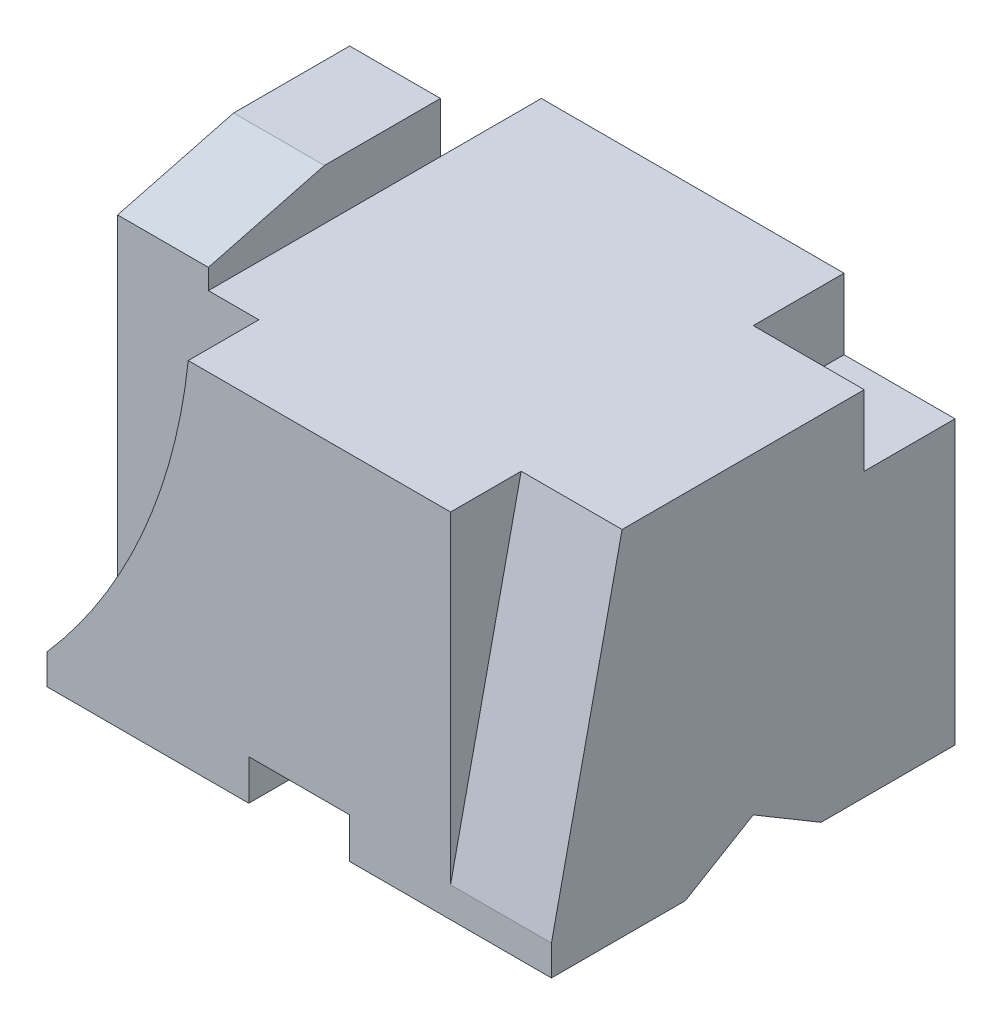
ISO-10303-21;
HEADER;
FILE_DESCRIPTION(('STEP AP214'),'2;1');
FILE_NAME('part.step','',(''),(''),'','','');
FILE_SCHEMA(('AUTOMOTIVE_DESIGN { 1 0 10303 214 1 1 1 1 }'));
ENDSEC;
DATA;
#1=APPLICATION_CONTEXT('core data for automotive mechanical design processes');
#2=APPLICATION_PROTOCOL_DEFINITION('international standard','automotive_design',2000,#1);
#3=PRODUCT_CONTEXT('',#1,'mechanical');
#4=PRODUCT('Part','Part','',(#3));
#5=PRODUCT_RELATED_PRODUCT_CATEGORY('part','',(#4));
#6=PRODUCT_DEFINITION_FORMATION('','',#4);
#7=PRODUCT_DEFINITION_CONTEXT('part definition',#1,'design');
#8=PRODUCT_DEFINITION('design','',#6,#7);
#9=PRODUCT_DEFINITION_SHAPE('','',#8);
#10=(LENGTH_UNIT() NAMED_UNIT(*) SI_UNIT(.MILLI.,.METRE.));
#11=(NAMED_UNIT(*) PLANE_ANGLE_UNIT() SI_UNIT($,.RADIAN.));
#12=(NAMED_UNIT(*) SI_UNIT($,.STERADIAN.) SOLID_ANGLE_UNIT());
#13=UNCERTAINTY_MEASURE_WITH_UNIT(LENGTH_MEASURE(1.E-05),#10,'distance_accuracy_value','');
#14=(GEOMETRIC_REPRESENTATION_CONTEXT(3) GLOBAL_UNCERTAINTY_ASSIGNED_CONTEXT((#13)) GLOBAL_UNIT_ASSIGNED_CONTEXT((#10,
#11,#12)) REPRESENTATION_CONTEXT('',''));
#15=CARTESIAN_POINT('',(0.,0.,0.));
#16=DIRECTION('',(0.,0.,1.));
#17=DIRECTION('',(1.,0.,0.));
#18=AXIS2_PLACEMENT_3D('',#15,#16,#17);
#19=CARTESIAN_POINT('',(0.,40.,-40.));
#20=DIRECTION('',(0.,0.,1.));
#21=DIRECTION('',(1.,0.,0.));
#22=AXIS2_PLACEMENT_3D('',#19,#20,#21);
#23=PLANE('',#22);
#24=DIRECTION('',(-1.,0.,0.));
#25=VECTOR('',#24,1.);
#26=CARTESIAN_POINT('',(0.,28.,-40.));
#27=LINE('',#26,#25);
#28=CARTESIAN_POINT('',(50.,28.,-40.));
#29=VERTEX_POINT('',#28);
#30=CARTESIAN_POINT('',(39.,28.,-40.));
#31=VERTEX_POINT('',#30);
#32=EDGE_CURVE('E217',#29,#31,#27,.T.);
#33=ORIENTED_EDGE('',*,*,#32,.F.);
#34=DIRECTION('',(0.,-1.,0.));
#35=VECTOR('',#34,1.);
#36=CARTESIAN_POINT('',(50.,40.,-40.));
#37=LINE('',#36,#35);
#38=CARTESIAN_POINT('',(50.,0.,-40.));
#39=VERTEX_POINT('',#38);
#40=EDGE_CURVE('E396',#29,#39,#37,.T.);
#41=ORIENTED_EDGE('',*,*,#40,.T.);
#42=DIRECTION('',(-1.,0.,0.));
#43=VECTOR('',#42,1.);
#44=CARTESIAN_POINT('',(0.,0.,-40.));
#45=LINE('',#44,#43);
#46=CARTESIAN_POINT('',(30.,0.,-40.));
#47=VERTEX_POINT('',#46);
#48=EDGE_CURVE('E386',#39,#47,#45,.T.);
#49=ORIENTED_EDGE('',*,*,#48,.T.);
#50=DIRECTION('',(0.,-1.,0.));
#51=VECTOR('',#50,1.);
#52=CARTESIAN_POINT('',(30.,0.,-40.));
#53=LINE('',#52,#51);
#54=CARTESIAN_POINT('',(30.,4.,-40.));
#55=VERTEX_POINT('',#54);
#56=EDGE_CURVE('E345',#55,#47,#53,.T.);
#57=ORIENTED_EDGE('',*,*,#56,.F.);
#58=DIRECTION('',(1.,0.,0.));
#59=VECTOR('',#58,1.);
#60=CARTESIAN_POINT('',(0.,4.,-40.));
#61=LINE('',#60,#59);
#62=CARTESIAN_POINT('',(20.,4.,-40.));
#63=VERTEX_POINT('',#62);
#64=EDGE_CURVE('E347',#63,#55,#61,.T.);
#65=ORIENTED_EDGE('',*,*,#64,.F.);
#66=DIRECTION('',(0.,-1.,0.));
#67=VECTOR('',#66,1.);
#68=CARTESIAN_POINT('',(20.,0.,-40.));
#69=LINE('',#68,#67);
#70=CARTESIAN_POINT('',(20.,0.,-40.));
#71=VERTEX_POINT('',#70);
#72=EDGE_CURVE('E349',#63,#71,#69,.T.);
#73=ORIENTED_EDGE('',*,*,#72,.T.);
#74=CARTESIAN_POINT('',(0.,0.,-40.));
#75=VERTEX_POINT('',#74);
#76=EDGE_CURVE('E465',#71,#75,#45,.T.);
#77=ORIENTED_EDGE('',*,*,#76,.T.);
#78=DIRECTION('',(0.,-1.,0.));
#79=VECTOR('',#78,1.);
#80=CARTESIAN_POINT('',(0.,40.,-40.));
#81=LINE('',#80,#79);
#82=CARTESIAN_POINT('',(0.,22.,-40.));
#83=VERTEX_POINT('',#82);
#84=EDGE_CURVE('E385',#83,#75,#81,.T.);
#85=ORIENTED_EDGE('',*,*,#84,.F.);
#86=DIRECTION('',(1.,0.,0.));
#87=VECTOR('',#86,1.);
#88=CARTESIAN_POINT('',(-156.873028952982,22.,-39.9999999999999));
#89=LINE('',#88,#87);
#90=CARTESIAN_POINT('',(8.99999999999997,22.,-40.));
#91=VERTEX_POINT('',#90);
#92=EDGE_CURVE('E251',#83,#91,#89,.T.);
#93=ORIENTED_EDGE('',*,*,#92,.T.);
#94=DIRECTION('',(0.,1.,0.));
#95=VECTOR('',#94,1.);
#96=CARTESIAN_POINT('',(8.99999999999999,40.,-40.));
#97=LINE('',#96,#95);
#98=CARTESIAN_POINT('',(9.00000000000001,35.,-40.));
#99=VERTEX_POINT('',#98);
#100=EDGE_CURVE('E388',#91,#99,#97,.T.);
#101=ORIENTED_EDGE('',*,*,#100,.T.);
#102=DIRECTION('',(1.,0.,0.));
#103=VECTOR('',#102,1.);
#104=CARTESIAN_POINT('',(0.,35.,-40.));
#105=LINE('',#104,#103);
#106=CARTESIAN_POINT('',(39.,35.,-40.));
#107=VERTEX_POINT('',#106);
#108=EDGE_CURVE('E304',#99,#107,#105,.T.);
#109=ORIENTED_EDGE('',*,*,#108,.T.);
#110=DIRECTION('',(0.,1.,0.));
#111=VECTOR('',#110,1.);
#112=CARTESIAN_POINT('',(39.,40.,-40.));
#113=LINE('',#112,#111);
#114=EDGE_CURVE('E235',#31,#107,#113,.T.);
#115=ORIENTED_EDGE('',*,*,#114,.F.);
#116=EDGE_LOOP('',(#33,#41,#49,#57,#65,#73,#77,#85,#93,#101,#109,#115));
#117=FACE_BOUND('',#116,.T.);
#118=ADVANCED_FACE('F35',(#117),#23,.F.);
#119=CARTESIAN_POINT('',(0.,35.,-40.));
#120=DIRECTION('',(0.,-1.,0.));
#121=DIRECTION('',(0.,0.,-1.));
#122=AXIS2_PLACEMENT_3D('',#119,#120,#121);
#123=PLANE('',#122);
#124=DIRECTION('',(0.,0.,1.));
#125=VECTOR('',#124,1.);
#126=CARTESIAN_POINT('',(39.,35.,-40.000012));
#127=LINE('',#126,#125);
#128=CARTESIAN_POINT('',(39.,35.,-31.));
#129=VERTEX_POINT('',#128);
#130=EDGE_CURVE('E220',#107,#129,#127,.T.);
#131=ORIENTED_EDGE('',*,*,#130,.F.);
#132=ORIENTED_EDGE('',*,*,#108,.F.);
#133=DIRECTION('',(0.,0.,1.));
#134=VECTOR('',#133,1.);
#135=CARTESIAN_POINT('',(9.00000000000001,35.,-40.));
#136=LINE('',#135,#134);
#137=CARTESIAN_POINT('',(9.00000000000001,35.,-30.));
#138=VERTEX_POINT('',#137);
#139=EDGE_CURVE('E314',#99,#138,#136,.T.);
#140=ORIENTED_EDGE('',*,*,#139,.T.);
#141=CARTESIAN_POINT('',(9.00000000000001,35.,-7.));
#142=VERTEX_POINT('',#141);
#143=EDGE_CURVE('E307',#138,#142,#136,.T.);
#144=ORIENTED_EDGE('',*,*,#143,.T.);
#145=DIRECTION('',(-1.,0.,0.));
#146=VECTOR('',#145,1.);
#147=CARTESIAN_POINT('',(0.,35.,-7.));
#148=LINE('',#147,#146);
#149=CARTESIAN_POINT('',(14.,35.,-7.));
#150=VERTEX_POINT('',#149);
#151=EDGE_CURVE('E290',#150,#142,#148,.T.);
#152=ORIENTED_EDGE('',*,*,#151,.F.);
#153=DIRECTION('',(0.,0.,1.));
#154=VECTOR('',#153,1.);
#155=CARTESIAN_POINT('',(14.,35.,-7.));
#156=LINE('',#155,#154);
#157=CARTESIAN_POINT('',(14.,35.,0.));
#158=VERTEX_POINT('',#157);
#159=EDGE_CURVE('E298',#150,#158,#156,.T.);
#160=ORIENTED_EDGE('',*,*,#159,.T.);
#161=DIRECTION('',(-1.,0.,0.));
#162=VECTOR('',#161,1.);
#163=CARTESIAN_POINT('',(0.,35.,0.));
#164=LINE('',#163,#162);
#165=CARTESIAN_POINT('',(40.,35.,0.));
#166=VERTEX_POINT('',#165);
#167=EDGE_CURVE('E311',#166,#158,#164,.T.);
#168=ORIENTED_EDGE('',*,*,#167,.F.);
#169=DIRECTION('',(0.,0.,1.));
#170=VECTOR('',#169,1.);
#171=CARTESIAN_POINT('',(40.,35.,0.));
#172=LINE('',#171,#170);
#173=CARTESIAN_POINT('',(40.,35.,-7.00000000000001));
#174=VERTEX_POINT('',#173);
#175=EDGE_CURVE('E274',#174,#166,#172,.T.);
#176=ORIENTED_EDGE('',*,*,#175,.F.);
#177=DIRECTION('',(-1.,0.,0.));
#178=VECTOR('',#177,1.);
#179=CARTESIAN_POINT('',(50.000012,35.,-7.00000000000001));
#180=LINE('',#179,#178);
#181=CARTESIAN_POINT('',(50.,35.,-7.00000000000001));
#182=VERTEX_POINT('',#181);
#183=EDGE_CURVE('E277',#182,#174,#180,.T.);
#184=ORIENTED_EDGE('',*,*,#183,.F.);
#185=DIRECTION('',(0.,0.,1.));
#186=VECTOR('',#185,1.);
#187=CARTESIAN_POINT('',(50.,35.,-40.));
#188=LINE('',#187,#186);
#189=CARTESIAN_POINT('',(50.,35.,-31.));
#190=VERTEX_POINT('',#189);
#191=EDGE_CURVE('E312',#190,#182,#188,.T.);
#192=ORIENTED_EDGE('',*,*,#191,.F.);
#193=DIRECTION('',(1.,0.,0.));
#194=VECTOR('',#193,1.);
#195=CARTESIAN_POINT('',(0.,35.,-31.));
#196=LINE('',#195,#194);
#197=EDGE_CURVE('E50',#129,#190,#196,.T.);
#198=ORIENTED_EDGE('',*,*,#197,.F.);
#199=EDGE_LOOP('',(#131,#132,#140,#144,#152,#160,#168,#176,#184,#192,#198));
#200=FACE_BOUND('',#199,.T.);
#201=ADVANCED_FACE('F474',(#200),#123,.F.);
#202=CARTESIAN_POINT('',(50.,40.,0.));
#203=DIRECTION('',(-1.,0.,0.));
#204=DIRECTION('',(0.,0.,1.));
#205=AXIS2_PLACEMENT_3D('',#202,#203,#204);
#206=PLANE('',#205);
#207=DIRECTION('',(0.,0.,-1.));
#208=VECTOR('',#207,1.);
#209=CARTESIAN_POINT('',(50.,28.,0.));
#210=LINE('',#209,#208);
#211=CARTESIAN_POINT('',(50.,28.,-31.));
#212=VERTEX_POINT('',#211);
#213=EDGE_CURVE('E11',#212,#29,#210,.T.);
#214=ORIENTED_EDGE('',*,*,#213,.F.);
#215=DIRECTION('',(0.,-1.,0.));
#216=VECTOR('',#215,1.);
#217=CARTESIAN_POINT('',(50.,0.,-31.));
#218=LINE('',#217,#216);
#219=EDGE_CURVE('E227',#190,#212,#218,.T.);
#220=ORIENTED_EDGE('',*,*,#219,.F.);
#221=ORIENTED_EDGE('',*,*,#191,.T.);
#222=DIRECTION('',(0.,0.976900017396262,-0.213696878805433));
#223=VECTOR('',#222,1.);
#224=CARTESIAN_POINT('',(50.,38.3103448275862,-7.72413793103449));
#225=LINE('',#224,#223);
#226=CARTESIAN_POINT('',(50.,3.00000000000008,0.));
#227=VERTEX_POINT('',#226);
#228=EDGE_CURVE('E279',#227,#182,#225,.T.);
#229=ORIENTED_EDGE('',*,*,#228,.F.);
#230=DIRECTION('',(0.,-1.,0.));
#231=VECTOR('',#230,1.);
#232=CARTESIAN_POINT('',(50.,40.,0.));
#233=LINE('',#232,#231);
#234=CARTESIAN_POINT('',(50.,0.,0.));
#235=VERTEX_POINT('',#234);
#236=EDGE_CURVE('E392',#227,#235,#233,.T.);
#237=ORIENTED_EDGE('',*,*,#236,.T.);
#238=DIRECTION('',(0.,0.,-1.));
#239=VECTOR('',#238,1.);
#240=CARTESIAN_POINT('',(50.,0.,0.));
#241=LINE('',#240,#239);
#242=CARTESIAN_POINT('',(50.,0.,-13.2783519094649));
#243=VERTEX_POINT('',#242);
#244=EDGE_CURVE('E441',#235,#243,#241,.T.);
#245=ORIENTED_EDGE('',*,*,#244,.T.);
#246=DIRECTION('',(0.,0.511391249008345,-0.859348003103332));
#247=VECTOR('',#246,1.);
#248=CARTESIAN_POINT('',(50.,-5.83534501104606,-3.47256799668696));
#249=LINE('',#248,#247);
#250=CARTESIAN_POINT('',(50.,4.,-20.));
#251=VERTEX_POINT('',#250);
#252=EDGE_CURVE('E318',#243,#251,#249,.T.);
#253=ORIENTED_EDGE('',*,*,#252,.T.);
#254=DIRECTION('',(0.,0.511391249008345,0.859348003103333));
#255=VECTOR('',#254,1.);
#256=CARTESIAN_POINT('',(50.,11.7431769345475,-6.98827238580567));
#257=LINE('',#256,#255);
#258=CARTESIAN_POINT('',(50.,0.,-26.7216480905352));
#259=VERTEX_POINT('',#258);
#260=EDGE_CURVE('E321',#259,#251,#257,.T.);
#261=ORIENTED_EDGE('',*,*,#260,.F.);
#262=EDGE_CURVE('E432',#259,#39,#241,.T.);
#263=ORIENTED_EDGE('',*,*,#262,.T.);
#264=ORIENTED_EDGE('',*,*,#40,.F.);
#265=EDGE_LOOP('',(#214,#220,#221,#229,#237,#245,#253,#261,#263,#264));
#266=FACE_BOUND('',#265,.T.);
#267=ADVANCED_FACE('F437',(#266),#206,.F.);
#268=CARTESIAN_POINT('',(0.,40.,0.));
#269=DIRECTION('',(1.,0.,0.));
#270=DIRECTION('',(0.,0.,-1.));
#271=AXIS2_PLACEMENT_3D('',#268,#269,#270);
#272=PLANE('',#271);
#273=DIRECTION('',(0.,-0.252421897147002,0.967617272396844));
#274=VECTOR('',#273,1.);
#275=CARTESIAN_POINT('',(0.,35.4814159292035,-1.1787610619469));
#276=LINE('',#275,#274);
#277=CARTESIAN_POINT('',(0.,40.,-18.5));
#278=VERTEX_POINT('',#277);
#279=CARTESIAN_POINT('',(0.,37.,-7.));
#280=VERTEX_POINT('',#279);
#281=EDGE_CURVE('E58',#278,#280,#276,.T.);
#282=ORIENTED_EDGE('',*,*,#281,.F.);
#283=DIRECTION('',(0.,0.,1.));
#284=VECTOR('',#283,1.);
#285=CARTESIAN_POINT('',(0.,40.,0.));
#286=LINE('',#285,#284);
#287=CARTESIAN_POINT('',(0.,40.,-30.));
#288=VERTEX_POINT('',#287);
#289=EDGE_CURVE('E382',#288,#278,#286,.T.);
#290=ORIENTED_EDGE('',*,*,#289,.F.);
#291=DIRECTION('',(0.,-1.,0.));
#292=VECTOR('',#291,1.);
#293=CARTESIAN_POINT('',(0.,22.,-30.));
#294=LINE('',#293,#292);
#295=CARTESIAN_POINT('',(0.,22.,-30.));
#296=VERTEX_POINT('',#295);
#297=EDGE_CURVE('E245',#288,#296,#294,.T.);
#298=ORIENTED_EDGE('',*,*,#297,.T.);
#299=DIRECTION('',(0.,0.,-1.));
#300=VECTOR('',#299,1.);
#301=CARTESIAN_POINT('',(0.,22.,-40.));
#302=LINE('',#301,#300);
#303=EDGE_CURVE('E256',#296,#83,#302,.T.);
#304=ORIENTED_EDGE('',*,*,#303,.T.);
#305=ORIENTED_EDGE('',*,*,#84,.T.);
#306=DIRECTION('',(0.,0.,1.));
#307=VECTOR('',#306,1.);
#308=CARTESIAN_POINT('',(0.,0.,0.));
#309=LINE('',#308,#307);
#310=CARTESIAN_POINT('',(0.,0.,-26.7216480905352));
#311=VERTEX_POINT('',#310);
#312=EDGE_CURVE('E380',#75,#311,#309,.T.);
#313=ORIENTED_EDGE('',*,*,#312,.T.);
#314=DIRECTION('',(0.,-0.511391249008345,-0.859348003103332));
#315=VECTOR('',#314,1.);
#316=CARTESIAN_POINT('',(0.,22.2040173170401,10.5902495597879));
#317=LINE('',#316,#315);
#318=CARTESIAN_POINT('',(0.,4.,-20.));
#319=VERTEX_POINT('',#318);
#320=EDGE_CURVE('E343',#319,#311,#317,.T.);
#321=ORIENTED_EDGE('',*,*,#320,.F.);
#322=DIRECTION('',(0.,-0.511391249008345,0.859348003103332));
#323=VECTOR('',#322,1.);
#324=CARTESIAN_POINT('',(0.,4.62549537144653,-21.0510899422806));
#325=LINE('',#324,#323);
#326=CARTESIAN_POINT('',(0.,0.,-13.2783519094648));
#327=VERTEX_POINT('',#326);
#328=EDGE_CURVE('E337',#319,#327,#325,.T.);
#329=ORIENTED_EDGE('',*,*,#328,.T.);
#330=CARTESIAN_POINT('',(0.,0.,0.));
#331=VERTEX_POINT('',#330);
#332=EDGE_CURVE('E377',#327,#331,#309,.T.);
#333=ORIENTED_EDGE('',*,*,#332,.T.);
#334=DIRECTION('',(0.,-1.,0.));
#335=VECTOR('',#334,1.);
#336=CARTESIAN_POINT('',(0.,40.,0.));
#337=LINE('',#336,#335);
#338=CARTESIAN_POINT('',(0.,3.,0.));
#339=VERTEX_POINT('',#338);
#340=EDGE_CURVE('E395',#339,#331,#337,.T.);
#341=ORIENTED_EDGE('',*,*,#340,.F.);
#342=DIRECTION('',(0.,0.,1.));
#343=VECTOR('',#342,1.);
#344=CARTESIAN_POINT('',(0.,3.,-7.));
#345=LINE('',#344,#343);
#346=CARTESIAN_POINT('',(0.,3.,-7.));
#347=VERTEX_POINT('',#346);
#348=EDGE_CURVE('E301',#347,#339,#345,.T.);
#349=ORIENTED_EDGE('',*,*,#348,.F.);
#350=DIRECTION('',(0.,-1.,0.));
#351=VECTOR('',#350,1.);
#352=CARTESIAN_POINT('',(0.,0.,-7.));
#353=LINE('',#352,#351);
#354=EDGE_CURVE('E296',#280,#347,#353,.T.);
#355=ORIENTED_EDGE('',*,*,#354,.F.);
#356=EDGE_LOOP('',(#282,#290,#298,#304,#305,#313,#321,#329,#333,#341,#349,#355));
#357=FACE_BOUND('',#356,.T.);
#358=ADVANCED_FACE('F37',(#357),#272,.F.);
#359=CARTESIAN_POINT('',(0.,40.,0.));
#360=DIRECTION('',(0.,-1.,0.));
#361=DIRECTION('',(0.,0.,-1.));
#362=AXIS2_PLACEMENT_3D('',#359,#360,#361);
#363=PLANE('',#362);
#364=DIRECTION('',(-1.,0.,0.));
#365=VECTOR('',#364,1.);
#366=CARTESIAN_POINT('',(8.99999999999999,40.,-18.5));
#367=LINE('',#366,#365);
#368=CARTESIAN_POINT('',(8.99999999999999,40.,-18.5));
#369=VERTEX_POINT('',#368);
#370=EDGE_CURVE('E240',#369,#278,#367,.T.);
#371=ORIENTED_EDGE('',*,*,#370,.F.);
#372=DIRECTION('',(0.,0.,1.));
#373=VECTOR('',#372,1.);
#374=CARTESIAN_POINT('',(9.00000000000001,40.,-40.));
#375=LINE('',#374,#373);
#376=CARTESIAN_POINT('',(8.99999999999997,40.,-30.));
#377=VERTEX_POINT('',#376);
#378=EDGE_CURVE('E308',#377,#369,#375,.T.);
#379=ORIENTED_EDGE('',*,*,#378,.F.);
#380=DIRECTION('',(1.,0.,0.));
#381=VECTOR('',#380,1.);
#382=CARTESIAN_POINT('',(-156.873028952982,40.,-29.9999999999999));
#383=LINE('',#382,#381);
#384=EDGE_CURVE('E263',#288,#377,#383,.T.);
#385=ORIENTED_EDGE('',*,*,#384,.F.);
#386=ORIENTED_EDGE('',*,*,#289,.T.);
#387=EDGE_LOOP('',(#371,#379,#385,#386));
#388=FACE_BOUND('',#387,.T.);
#389=ADVANCED_FACE('F540',(#388),#363,.F.);
#390=CARTESIAN_POINT('',(9.00000000000001,0.,-40.));
#391=DIRECTION('',(-1.,0.,0.));
#392=DIRECTION('',(0.,0.,1.));
#393=AXIS2_PLACEMENT_3D('',#390,#391,#392);
#394=PLANE('',#393);
#395=DIRECTION('',(0.,-0.252421897147002,0.967617272396844));
#396=VECTOR('',#395,1.);
#397=CARTESIAN_POINT('',(9.,32.9327433628319,8.59115044247786));
#398=LINE('',#397,#396);
#399=CARTESIAN_POINT('',(9.,37.,-7.));
#400=VERTEX_POINT('',#399);
#401=EDGE_CURVE('E237',#369,#400,#398,.T.);
#402=ORIENTED_EDGE('',*,*,#401,.T.);
#403=DIRECTION('',(0.,1.,0.));
#404=VECTOR('',#403,1.);
#405=CARTESIAN_POINT('',(9.00000000000001,0.,-7.));
#406=LINE('',#405,#404);
#407=EDGE_CURVE('E293',#142,#400,#406,.T.);
#408=ORIENTED_EDGE('',*,*,#407,.F.);
#409=ORIENTED_EDGE('',*,*,#143,.F.);
#410=DIRECTION('',(0.,-1.,0.));
#411=VECTOR('',#410,1.);
#412=CARTESIAN_POINT('',(9.00000000000001,22.,-30.));
#413=LINE('',#412,#411);
#414=EDGE_CURVE('E248',#377,#138,#413,.T.);
#415=ORIENTED_EDGE('',*,*,#414,.F.);
#416=ORIENTED_EDGE('',*,*,#378,.T.);
#417=EDGE_LOOP('',(#402,#408,#409,#415,#416));
#418=FACE_BOUND('',#417,.T.);
#419=ADVANCED_FACE('F535',(#418),#394,.F.);
#420=CARTESIAN_POINT('',(0.,0.,-7.));
#421=DIRECTION('',(0.,0.,1.));
#422=DIRECTION('',(1.,0.,0.));
#423=AXIS2_PLACEMENT_3D('',#420,#421,#422);
#424=PLANE('',#423);
#425=ORIENTED_EDGE('',*,*,#407,.T.);
#426=DIRECTION('',(-1.,0.,0.));
#427=VECTOR('',#426,1.);
#428=CARTESIAN_POINT('',(0.,37.,-7.));
#429=LINE('',#428,#427);
#430=EDGE_CURVE('E43',#400,#280,#429,.T.);
#431=ORIENTED_EDGE('',*,*,#430,.T.);
#432=ORIENTED_EDGE('',*,*,#354,.T.);
#433=CARTESIAN_POINT('',(-43.6710380627894,41.1685791524704,-7.));
#434=DIRECTION('',(0.,0.,1.));
#435=DIRECTION('',(1.,0.,0.));
#436=AXIS2_PLACEMENT_3D('',#433,#434,#435);
#437=CIRCLE('',#436,58.);
#438=EDGE_CURVE('E285',#150,#347,#437,.F.);
#439=ORIENTED_EDGE('',*,*,#438,.F.);
#440=ORIENTED_EDGE('',*,*,#151,.T.);
#441=EDGE_LOOP('',(#425,#431,#432,#439,#440));
#442=FACE_BOUND('',#441,.T.);
#443=ADVANCED_FACE('F490',(#442),#424,.T.);
#444=CARTESIAN_POINT('',(0.,40.,0.));
#445=DIRECTION('',(0.,0.,-1.));
#446=DIRECTION('',(-1.,0.,0.));
#447=AXIS2_PLACEMENT_3D('',#444,#445,#446);
#448=PLANE('',#447);
#449=DIRECTION('',(1.,0.,0.));
#450=VECTOR('',#449,1.);
#451=CARTESIAN_POINT('',(40.,3.00000000000008,0.));
#452=LINE('',#451,#450);
#453=CARTESIAN_POINT('',(40.,3.00000000000008,0.));
#454=VERTEX_POINT('',#453);
#455=EDGE_CURVE('E276',#454,#227,#452,.T.);
#456=ORIENTED_EDGE('',*,*,#455,.F.);
#457=DIRECTION('',(0.,-1.,0.));
#458=VECTOR('',#457,1.);
#459=CARTESIAN_POINT('',(40.,0.,0.));
#460=LINE('',#459,#458);
#461=EDGE_CURVE('E268',#166,#454,#460,.T.);
#462=ORIENTED_EDGE('',*,*,#461,.F.);
#463=ORIENTED_EDGE('',*,*,#167,.T.);
#464=CARTESIAN_POINT('',(-43.6710380627894,41.1685791524704,0.));
#465=DIRECTION('',(0.,0.,1.));
#466=DIRECTION('',(1.,0.,0.));
#467=AXIS2_PLACEMENT_3D('',#464,#465,#466);
#468=CIRCLE('',#467,58.);
#469=EDGE_CURVE('E303',#158,#339,#468,.F.);
#470=ORIENTED_EDGE('',*,*,#469,.T.);
#471=ORIENTED_EDGE('',*,*,#340,.T.);
#472=DIRECTION('',(1.,0.,0.));
#473=VECTOR('',#472,1.);
#474=CARTESIAN_POINT('',(0.,0.,0.));
#475=LINE('',#474,#473);
#476=CARTESIAN_POINT('',(20.,0.,0.));
#477=VERTEX_POINT('',#476);
#478=EDGE_CURVE('E497',#331,#477,#475,.T.);
#479=ORIENTED_EDGE('',*,*,#478,.T.);
#480=DIRECTION('',(0.,1.,0.));
#481=VECTOR('',#480,1.);
#482=CARTESIAN_POINT('',(20.0000000000001,40.,0.));
#483=LINE('',#482,#481);
#484=CARTESIAN_POINT('',(20.,4.,0.));
#485=VERTEX_POINT('',#484);
#486=EDGE_CURVE('E371',#477,#485,#483,.T.);
#487=ORIENTED_EDGE('',*,*,#486,.T.);
#488=DIRECTION('',(-1.,0.,0.));
#489=VECTOR('',#488,1.);
#490=CARTESIAN_POINT('',(0.,4.,0.));
#491=LINE('',#490,#489);
#492=CARTESIAN_POINT('',(30.,4.,0.));
#493=VERTEX_POINT('',#492);
#494=EDGE_CURVE('E374',#493,#485,#491,.T.);
#495=ORIENTED_EDGE('',*,*,#494,.F.);
#496=DIRECTION('',(0.,1.,0.));
#497=VECTOR('',#496,1.);
#498=CARTESIAN_POINT('',(30.,40.,0.));
#499=LINE('',#498,#497);
#500=CARTESIAN_POINT('',(30.,0.,0.));
#501=VERTEX_POINT('',#500);
#502=EDGE_CURVE('E356',#501,#493,#499,.T.);
#503=ORIENTED_EDGE('',*,*,#502,.F.);
#504=EDGE_CURVE('E449',#501,#235,#475,.T.);
#505=ORIENTED_EDGE('',*,*,#504,.T.);
#506=ORIENTED_EDGE('',*,*,#236,.F.);
#507=EDGE_LOOP('',(#456,#462,#463,#470,#471,#479,#487,#495,#503,#505,#506));
#508=FACE_BOUND('',#507,.T.);
#509=ADVANCED_FACE('F452',(#508),#448,.F.);
#510=CARTESIAN_POINT('',(0.,0.,0.));
#511=DIRECTION('',(0.,-1.,0.));
#512=DIRECTION('',(0.,0.,-1.));
#513=AXIS2_PLACEMENT_3D('',#510,#511,#512);
#514=PLANE('',#513);
#515=ORIENTED_EDGE('',*,*,#262,.F.);
#516=DIRECTION('',(-1.,0.,0.));
#517=VECTOR('',#516,1.);
#518=CARTESIAN_POINT('',(50.,0.,-26.7216480905352));
#519=LINE('',#518,#517);
#520=CARTESIAN_POINT('',(30.,0.,-26.7216480905352));
#521=VERTEX_POINT('',#520);
#522=EDGE_CURVE('E324',#259,#521,#519,.T.);
#523=ORIENTED_EDGE('',*,*,#522,.T.);
#524=DIRECTION('',(0.,0.,1.));
#525=VECTOR('',#524,1.);
#526=CARTESIAN_POINT('',(30.,0.,-40.));
#527=LINE('',#526,#525);
#528=EDGE_CURVE('E366',#47,#521,#527,.T.);
#529=ORIENTED_EDGE('',*,*,#528,.F.);
#530=ORIENTED_EDGE('',*,*,#48,.F.);
#531=EDGE_LOOP('',(#515,#523,#529,#530));
#532=FACE_BOUND('',#531,.T.);
#533=ADVANCED_FACE('F430',(#532),#514,.T.);
#534=DIRECTION('',(0.,0.,1.));
#535=VECTOR('',#534,1.);
#536=CARTESIAN_POINT('',(20.,0.,-40.));
#537=LINE('',#536,#535);
#538=CARTESIAN_POINT('',(20.,0.,-26.7216480905352));
#539=VERTEX_POINT('',#538);
#540=EDGE_CURVE('E353',#71,#539,#537,.T.);
#541=ORIENTED_EDGE('',*,*,#540,.T.);
#542=EDGE_CURVE('E328',#539,#311,#519,.T.);
#543=ORIENTED_EDGE('',*,*,#542,.T.);
#544=ORIENTED_EDGE('',*,*,#312,.F.);
#545=ORIENTED_EDGE('',*,*,#76,.F.);
#546=EDGE_LOOP('',(#541,#543,#544,#545));
#547=FACE_BOUND('',#546,.T.);
#548=ADVANCED_FACE('F462',(#547),#514,.T.);
#549=CARTESIAN_POINT('',(20.,0.,-40.));
#550=DIRECTION('',(-1.,0.,0.));
#551=DIRECTION('',(0.,-1.,0.));
#552=AXIS2_PLACEMENT_3D('',#549,#550,#551);
#553=PLANE('',#552);
#554=DIRECTION('',(0.,0.511391249008345,0.859348003103332));
#555=VECTOR('',#554,1.);
#556=CARTESIAN_POINT('',(20.,-5.83534501104607,-36.5274320033131));
#557=LINE('',#556,#555);
#558=CARTESIAN_POINT('',(20.,4.,-20.));
#559=VERTEX_POINT('',#558);
#560=EDGE_CURVE('E340',#539,#559,#557,.T.);
#561=ORIENTED_EDGE('',*,*,#560,.F.);
#562=ORIENTED_EDGE('',*,*,#540,.F.);
#563=ORIENTED_EDGE('',*,*,#72,.F.);
#564=DIRECTION('',(0.,0.,1.));
#565=VECTOR('',#564,1.);
#566=CARTESIAN_POINT('',(20.,4.,-40.));
#567=LINE('',#566,#565);
#568=EDGE_CURVE('E358',#63,#559,#567,.T.);
#569=ORIENTED_EDGE('',*,*,#568,.T.);
#570=EDGE_LOOP('',(#561,#562,#563,#569));
#571=FACE_BOUND('',#570,.T.);
#572=ADVANCED_FACE('F459',(#571),#553,.F.);
#573=CARTESIAN_POINT('',(30.,0.,-40.));
#574=DIRECTION('',(-1.,0.,0.));
#575=DIRECTION('',(0.,0.,1.));
#576=AXIS2_PLACEMENT_3D('',#573,#574,#575);
#577=PLANE('',#576);
#578=ORIENTED_EDGE('',*,*,#528,.T.);
#579=DIRECTION('',(0.,0.511391249008345,0.859348003103332));
#580=VECTOR('',#579,1.);
#581=CARTESIAN_POINT('',(30.,-5.83534501104605,-36.5274320033131));
#582=LINE('',#581,#580);
#583=CARTESIAN_POINT('',(30.,4.,-20.));
#584=VERTEX_POINT('',#583);
#585=EDGE_CURVE('E391',#521,#584,#582,.T.);
#586=ORIENTED_EDGE('',*,*,#585,.T.);
#587=DIRECTION('',(0.,0.,1.));
#588=VECTOR('',#587,1.);
#589=CARTESIAN_POINT('',(30.,4.,-40.));
#590=LINE('',#589,#588);
#591=EDGE_CURVE('E362',#55,#584,#590,.T.);
#592=ORIENTED_EDGE('',*,*,#591,.F.);
#593=ORIENTED_EDGE('',*,*,#56,.T.);
#594=EDGE_LOOP('',(#578,#586,#592,#593));
#595=FACE_BOUND('',#594,.T.);
#596=ADVANCED_FACE('F408',(#595),#577,.T.);
#597=DIRECTION('',(-1.,0.,0.));
#598=VECTOR('',#597,1.);
#599=CARTESIAN_POINT('',(50.,0.,-13.2783519094649));
#600=LINE('',#599,#598);
#601=CARTESIAN_POINT('',(30.,0.,-13.2783519094649));
#602=VERTEX_POINT('',#601);
#603=EDGE_CURVE('E333',#243,#602,#600,.T.);
#604=ORIENTED_EDGE('',*,*,#603,.F.);
#605=ORIENTED_EDGE('',*,*,#244,.F.);
#606=ORIENTED_EDGE('',*,*,#504,.F.);
#607=EDGE_CURVE('E352',#602,#501,#527,.T.);
#608=ORIENTED_EDGE('',*,*,#607,.F.);
#609=EDGE_LOOP('',(#604,#605,#606,#608));
#610=FACE_BOUND('',#609,.T.);
#611=ADVANCED_FACE('F446',(#610),#514,.T.);
#612=CARTESIAN_POINT('',(20.,0.,-13.2783519094649));
#613=VERTEX_POINT('',#612);
#614=EDGE_CURVE('E323',#613,#327,#600,.T.);
#615=ORIENTED_EDGE('',*,*,#614,.F.);
#616=EDGE_CURVE('E357',#613,#477,#537,.T.);
#617=ORIENTED_EDGE('',*,*,#616,.T.);
#618=ORIENTED_EDGE('',*,*,#478,.F.);
#619=ORIENTED_EDGE('',*,*,#332,.F.);
#620=EDGE_LOOP('',(#615,#617,#618,#619));
#621=FACE_BOUND('',#620,.T.);
#622=ADVANCED_FACE('F502',(#621),#514,.T.);
#623=CARTESIAN_POINT('',(0.,4.,-40.));
#624=DIRECTION('',(0.,-1.,0.));
#625=DIRECTION('',(1.,0.,0.));
#626=AXIS2_PLACEMENT_3D('',#623,#624,#625);
#627=PLANE('',#626);
#628=EDGE_CURVE('E361',#559,#485,#567,.T.);
#629=ORIENTED_EDGE('',*,*,#628,.F.);
#630=ORIENTED_EDGE('',*,*,#568,.F.);
#631=ORIENTED_EDGE('',*,*,#64,.T.);
#632=ORIENTED_EDGE('',*,*,#591,.T.);
#633=EDGE_CURVE('E365',#584,#493,#590,.T.);
#634=ORIENTED_EDGE('',*,*,#633,.T.);
#635=ORIENTED_EDGE('',*,*,#494,.T.);
#636=EDGE_LOOP('',(#629,#630,#631,#632,#634,#635));
#637=FACE_BOUND('',#636,.T.);
#638=ADVANCED_FACE('F420',(#637),#627,.T.);
#639=ORIENTED_EDGE('',*,*,#616,.F.);
#640=DIRECTION('',(0.,0.511391249008345,-0.859348003103332));
#641=VECTOR('',#640,1.);
#642=CARTESIAN_POINT('',(20.,11.7431769345475,-33.0117276141943));
#643=LINE('',#642,#641);
#644=EDGE_CURVE('E327',#613,#559,#643,.T.);
#645=ORIENTED_EDGE('',*,*,#644,.T.);
#646=ORIENTED_EDGE('',*,*,#628,.T.);
#647=ORIENTED_EDGE('',*,*,#486,.F.);
#648=EDGE_LOOP('',(#639,#645,#646,#647));
#649=FACE_BOUND('',#648,.T.);
#650=ADVANCED_FACE('F509',(#649),#553,.F.);
#651=DIRECTION('',(0.,0.511391249008345,-0.859348003103332));
#652=VECTOR('',#651,1.);
#653=CARTESIAN_POINT('',(30.,11.7431769345475,-33.0117276141943));
#654=LINE('',#653,#652);
#655=EDGE_CURVE('E403',#602,#584,#654,.T.);
#656=ORIENTED_EDGE('',*,*,#655,.F.);
#657=ORIENTED_EDGE('',*,*,#607,.T.);
#658=ORIENTED_EDGE('',*,*,#502,.T.);
#659=ORIENTED_EDGE('',*,*,#633,.F.);
#660=EDGE_LOOP('',(#656,#657,#658,#659));
#661=FACE_BOUND('',#660,.T.);
#662=ADVANCED_FACE('F414',(#661),#577,.T.);
#663=CARTESIAN_POINT('',(50.,-5.83534501104606,-3.47256799668696));
#664=DIRECTION('',(0.,0.859348003103332,0.511391249008345));
#665=DIRECTION('',(0.,-0.511391249008345,0.859348003103332));
#666=AXIS2_PLACEMENT_3D('',#663,#664,#665);
#667=PLANE('',#666);
#668=ORIENTED_EDGE('',*,*,#655,.T.);
#669=DIRECTION('',(-1.,0.,0.));
#670=VECTOR('',#669,1.);
#671=CARTESIAN_POINT('',(50.,4.,-20.));
#672=LINE('',#671,#670);
#673=EDGE_CURVE('E329',#251,#584,#672,.T.);
#674=ORIENTED_EDGE('',*,*,#673,.F.);
#675=ORIENTED_EDGE('',*,*,#252,.F.);
#676=ORIENTED_EDGE('',*,*,#603,.T.);
#677=EDGE_LOOP('',(#668,#674,#675,#676));
#678=FACE_BOUND('',#677,.T.);
#679=ADVANCED_FACE('F444',(#678),#667,.F.);
#680=CARTESIAN_POINT('',(50.,11.7431769345475,-6.98827238580567));
#681=DIRECTION('',(0.,-0.859348003103332,0.511391249008345));
#682=DIRECTION('',(0.,-0.511391249008345,-0.859348003103332));
#683=AXIS2_PLACEMENT_3D('',#680,#681,#682);
#684=PLANE('',#683);
#685=ORIENTED_EDGE('',*,*,#522,.F.);
#686=ORIENTED_EDGE('',*,*,#260,.T.);
#687=ORIENTED_EDGE('',*,*,#673,.T.);
#688=ORIENTED_EDGE('',*,*,#585,.F.);
#689=EDGE_LOOP('',(#685,#686,#687,#688));
#690=FACE_BOUND('',#689,.T.);
#691=ADVANCED_FACE('F434',(#690),#684,.T.);
#692=ORIENTED_EDGE('',*,*,#320,.T.);
#693=ORIENTED_EDGE('',*,*,#542,.F.);
#694=ORIENTED_EDGE('',*,*,#560,.T.);
#695=EDGE_CURVE('E332',#559,#319,#672,.T.);
#696=ORIENTED_EDGE('',*,*,#695,.T.);
#697=EDGE_LOOP('',(#692,#693,#694,#696));
#698=FACE_BOUND('',#697,.T.);
#699=ADVANCED_FACE('F506',(#698),#684,.T.);
#700=ORIENTED_EDGE('',*,*,#695,.F.);
#701=ORIENTED_EDGE('',*,*,#644,.F.);
#702=ORIENTED_EDGE('',*,*,#614,.T.);
#703=ORIENTED_EDGE('',*,*,#328,.F.);
#704=EDGE_LOOP('',(#700,#701,#702,#703));
#705=FACE_BOUND('',#704,.T.);
#706=ADVANCED_FACE('F508',(#705),#667,.F.);
#707=CARTESIAN_POINT('',(-43.6710380627894,41.1685791524704,-7.));
#708=DIRECTION('',(0.,0.,1.));
#709=DIRECTION('',(1.,0.,0.));
#710=AXIS2_PLACEMENT_3D('',#707,#708,#709);
#711=CYLINDRICAL_SURFACE('',#710,58.);
#712=ORIENTED_EDGE('',*,*,#469,.F.);
#713=ORIENTED_EDGE('',*,*,#159,.F.);
#714=ORIENTED_EDGE('',*,*,#438,.T.);
#715=ORIENTED_EDGE('',*,*,#348,.T.);
#716=EDGE_LOOP('',(#712,#713,#714,#715));
#717=FACE_BOUND('',#716,.T.);
#718=ADVANCED_FACE('F487',(#717),#711,.F.);
#719=CARTESIAN_POINT('',(50.000012,0.136999068033555,0.626281453867661));
#720=DIRECTION('',(0.,0.213696878805433,0.976900017396262));
#721=DIRECTION('',(0.,-0.976900017396262,0.213696878805433));
#722=AXIS2_PLACEMENT_3D('',#719,#720,#721);
#723=PLANE('',#722);
#724=ORIENTED_EDGE('',*,*,#228,.T.);
#725=ORIENTED_EDGE('',*,*,#183,.T.);
#726=DIRECTION('',(0.,0.976900017396262,-0.213696878805433));
#727=VECTOR('',#726,1.);
#728=CARTESIAN_POINT('',(40.,0.136999068033555,0.626281453867665));
#729=LINE('',#728,#727);
#730=EDGE_CURVE('E271',#454,#174,#729,.T.);
#731=ORIENTED_EDGE('',*,*,#730,.F.);
#732=ORIENTED_EDGE('',*,*,#455,.T.);
#733=EDGE_LOOP('',(#724,#725,#731,#732));
#734=FACE_BOUND('',#733,.T.);
#735=ADVANCED_FACE('F478',(#734),#723,.T.);
#736=CARTESIAN_POINT('',(40.,0.,0.));
#737=DIRECTION('',(1.,0.,0.));
#738=DIRECTION('',(0.,0.,-1.));
#739=AXIS2_PLACEMENT_3D('',#736,#737,#738);
#740=PLANE('',#739);
#741=ORIENTED_EDGE('',*,*,#461,.T.);
#742=ORIENTED_EDGE('',*,*,#730,.T.);
#743=ORIENTED_EDGE('',*,*,#175,.T.);
#744=EDGE_LOOP('',(#741,#742,#743));
#745=FACE_BOUND('',#744,.T.);
#746=ADVANCED_FACE('F480',(#745),#740,.T.);
#747=CARTESIAN_POINT('',(9.,40.,0.));
#748=DIRECTION('',(1.,0.,0.));
#749=DIRECTION('',(0.,0.,-1.));
#750=AXIS2_PLACEMENT_3D('',#747,#748,#749);
#751=PLANE('',#750);
#752=ORIENTED_EDGE('',*,*,#139,.F.);
#753=ORIENTED_EDGE('',*,*,#100,.F.);
#754=DIRECTION('',(0.,0.,-1.));
#755=VECTOR('',#754,1.);
#756=CARTESIAN_POINT('',(9.00000000000001,22.,-40.));
#757=LINE('',#756,#755);
#758=CARTESIAN_POINT('',(8.99999999999997,22.,-30.));
#759=VERTEX_POINT('',#758);
#760=EDGE_CURVE('E253',#759,#91,#757,.T.);
#761=ORIENTED_EDGE('',*,*,#760,.F.);
#762=EDGE_CURVE('E252',#138,#759,#413,.T.);
#763=ORIENTED_EDGE('',*,*,#762,.F.);
#764=EDGE_LOOP('',(#752,#753,#761,#763));
#765=FACE_BOUND('',#764,.T.);
#766=ADVANCED_FACE('F644',(#765),#751,.F.);
#767=CARTESIAN_POINT('',(-156.873028952982,22.,-29.9999999999999));
#768=DIRECTION('',(0.,0.,-1.));
#769=DIRECTION('',(-1.,0.,0.));
#770=AXIS2_PLACEMENT_3D('',#767,#768,#769);
#771=PLANE('',#770);
#772=ORIENTED_EDGE('',*,*,#297,.F.);
#773=ORIENTED_EDGE('',*,*,#384,.T.);
#774=ORIENTED_EDGE('',*,*,#414,.T.);
#775=ORIENTED_EDGE('',*,*,#762,.T.);
#776=DIRECTION('',(1.,0.,0.));
#777=VECTOR('',#776,1.);
#778=CARTESIAN_POINT('',(-156.873028952982,22.,-29.9999999999999));
#779=LINE('',#778,#777);
#780=EDGE_CURVE('E265',#296,#759,#779,.T.);
#781=ORIENTED_EDGE('',*,*,#780,.F.);
#782=EDGE_LOOP('',(#772,#773,#774,#775,#781));
#783=FACE_BOUND('',#782,.T.);
#784=ADVANCED_FACE('F637',(#783),#771,.T.);
#785=CARTESIAN_POINT('',(-156.873028952982,22.,-39.9999999999999));
#786=DIRECTION('',(0.,1.,0.));
#787=DIRECTION('',(0.,0.,1.));
#788=AXIS2_PLACEMENT_3D('',#785,#786,#787);
#789=PLANE('',#788);
#790=ORIENTED_EDGE('',*,*,#303,.F.);
#791=ORIENTED_EDGE('',*,*,#780,.T.);
#792=ORIENTED_EDGE('',*,*,#760,.T.);
#793=ORIENTED_EDGE('',*,*,#92,.F.);
#794=EDGE_LOOP('',(#790,#791,#792,#793));
#795=FACE_BOUND('',#794,.T.);
#796=ADVANCED_FACE('F642',(#795),#789,.T.);
#797=CARTESIAN_POINT('',(-1.19999999970193E-05,32.9327433628319,8.59115044247787));
#798=DIRECTION('',(0.,0.967617272396844,0.252421897147002));
#799=DIRECTION('',(0.,-0.252421897147002,0.967617272396844));
#800=AXIS2_PLACEMENT_3D('',#797,#798,#799);
#801=PLANE('',#800);
#802=ORIENTED_EDGE('',*,*,#281,.T.);
#803=ORIENTED_EDGE('',*,*,#430,.F.);
#804=ORIENTED_EDGE('',*,*,#401,.F.);
#805=ORIENTED_EDGE('',*,*,#370,.T.);
#806=EDGE_LOOP('',(#802,#803,#804,#805));
#807=FACE_BOUND('',#806,.T.);
#808=ADVANCED_FACE('F655',(#807),#801,.T.);
#809=CARTESIAN_POINT('',(39.,0.,-40.000012));
#810=DIRECTION('',(1.,0.,0.));
#811=DIRECTION('',(0.,0.,-1.));
#812=AXIS2_PLACEMENT_3D('',#809,#810,#811);
#813=PLANE('',#812);
#814=ORIENTED_EDGE('',*,*,#114,.T.);
#815=ORIENTED_EDGE('',*,*,#130,.T.);
#816=DIRECTION('',(0.,1.,0.));
#817=VECTOR('',#816,1.);
#818=CARTESIAN_POINT('',(39.,0.,-31.));
#819=LINE('',#818,#817);
#820=CARTESIAN_POINT('',(39.,28.,-31.));
#821=VERTEX_POINT('',#820);
#822=EDGE_CURVE('E222',#821,#129,#819,.T.);
#823=ORIENTED_EDGE('',*,*,#822,.F.);
#824=DIRECTION('',(0.,0.,1.));
#825=VECTOR('',#824,1.);
#826=CARTESIAN_POINT('',(39.,28.,-40.000012));
#827=LINE('',#826,#825);
#828=EDGE_CURVE('E211',#31,#821,#827,.T.);
#829=ORIENTED_EDGE('',*,*,#828,.F.);
#830=EDGE_LOOP('',(#814,#815,#823,#829));
#831=FACE_BOUND('',#830,.T.);
#832=ADVANCED_FACE('F223',(#831),#813,.T.);
#833=CARTESIAN_POINT('',(0.,28.,-40.000012));
#834=DIRECTION('',(0.,1.,0.));
#835=DIRECTION('',(0.,0.,1.));
#836=AXIS2_PLACEMENT_3D('',#833,#834,#835);
#837=PLANE('',#836);
#838=ORIENTED_EDGE('',*,*,#32,.T.);
#839=ORIENTED_EDGE('',*,*,#828,.T.);
#840=DIRECTION('',(-1.,0.,0.));
#841=VECTOR('',#840,1.);
#842=CARTESIAN_POINT('',(0.,28.,-31.));
#843=LINE('',#842,#841);
#844=EDGE_CURVE('E215',#212,#821,#843,.T.);
#845=ORIENTED_EDGE('',*,*,#844,.F.);
#846=ORIENTED_EDGE('',*,*,#213,.T.);
#847=EDGE_LOOP('',(#838,#839,#845,#846));
#848=FACE_BOUND('',#847,.T.);
#849=ADVANCED_FACE('F213',(#848),#837,.T.);
#850=CARTESIAN_POINT('',(0.,0.,-31.));
#851=DIRECTION('',(0.,0.,-1.));
#852=DIRECTION('',(-1.,0.,0.));
#853=AXIS2_PLACEMENT_3D('',#850,#851,#852);
#854=PLANE('',#853);
#855=ORIENTED_EDGE('',*,*,#844,.T.);
#856=ORIENTED_EDGE('',*,*,#822,.T.);
#857=ORIENTED_EDGE('',*,*,#197,.T.);
#858=ORIENTED_EDGE('',*,*,#219,.T.);
#859=EDGE_LOOP('',(#855,#856,#857,#858));
#860=FACE_BOUND('',#859,.T.);
#861=ADVANCED_FACE('F226',(#860),#854,.T.);
#862=CLOSED_SHELL('',(#118,#201,#267,#358,#389,#419,#443,#509,#533,#548,#572,#596,#611,#622,
#638,#650,#662,#679,#691,#699,#706,#718,#735,#746,#766,#784,#796,#808,#832,#849,#861));
#863=MANIFOLD_SOLID_BREP('B2',#862);
#864=ADVANCED_BREP_SHAPE_REPRESENTATION('',(#18,#863),#14);
#865=SHAPE_DEFINITION_REPRESENTATION(#9,#864);
ENDSEC;
END-ISO-10303-21;
